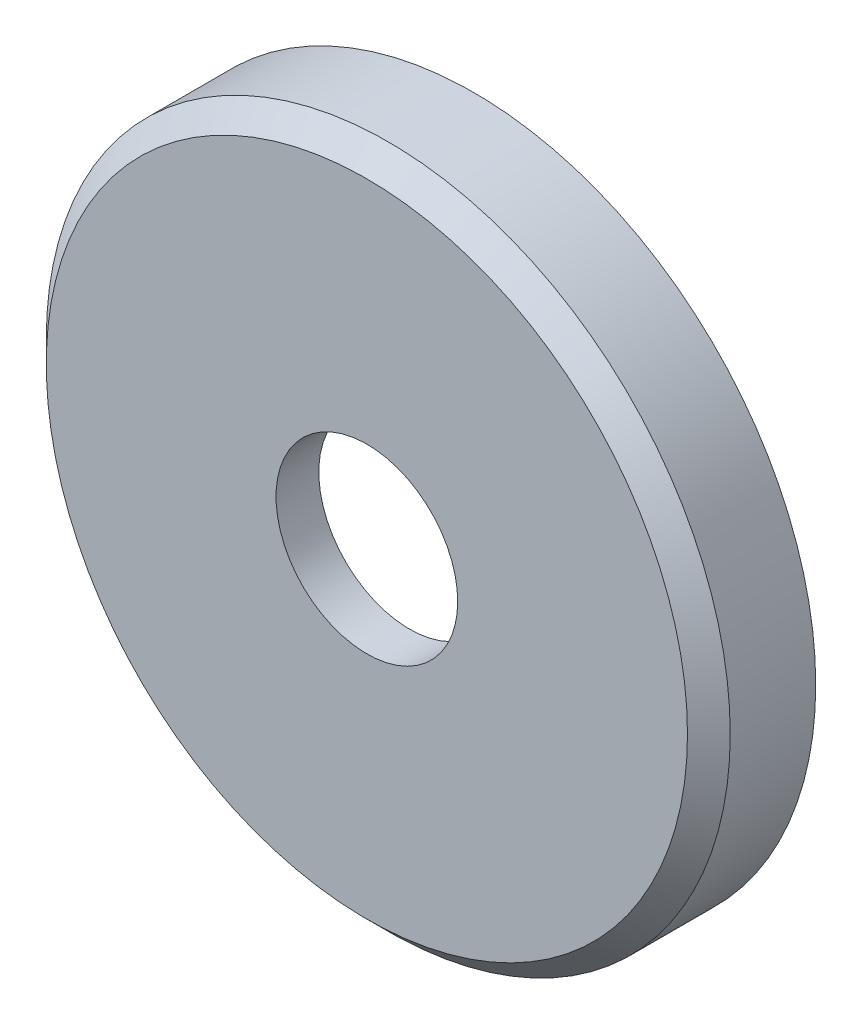
ISO-10303-21;
HEADER;
FILE_DESCRIPTION(('STEP AP214'),'2;1');
FILE_NAME('part.step','',(''),(''),'','','');
FILE_SCHEMA(('AUTOMOTIVE_DESIGN { 1 0 10303 214 1 1 1 1 }'));
ENDSEC;
DATA;
#1=APPLICATION_CONTEXT('core data for automotive mechanical design processes');
#2=APPLICATION_PROTOCOL_DEFINITION('international standard','automotive_design',2000,#1);
#3=PRODUCT_CONTEXT('',#1,'mechanical');
#4=PRODUCT('Part','Part','',(#3));
#5=PRODUCT_RELATED_PRODUCT_CATEGORY('part','',(#4));
#6=PRODUCT_DEFINITION_FORMATION('','',#4);
#7=PRODUCT_DEFINITION_CONTEXT('part definition',#1,'design');
#8=PRODUCT_DEFINITION('design','',#6,#7);
#9=PRODUCT_DEFINITION_SHAPE('','',#8);
#10=(LENGTH_UNIT() NAMED_UNIT(*) SI_UNIT(.MILLI.,.METRE.));
#11=(NAMED_UNIT(*) PLANE_ANGLE_UNIT() SI_UNIT($,.RADIAN.));
#12=(NAMED_UNIT(*) SI_UNIT($,.STERADIAN.) SOLID_ANGLE_UNIT());
#13=UNCERTAINTY_MEASURE_WITH_UNIT(LENGTH_MEASURE(1.E-05),#10,'distance_accuracy_value','');
#14=(GEOMETRIC_REPRESENTATION_CONTEXT(3) GLOBAL_UNCERTAINTY_ASSIGNED_CONTEXT((#13)) GLOBAL_UNIT_ASSIGNED_CONTEXT((#10,
#11,#12)) REPRESENTATION_CONTEXT('',''));
#15=CARTESIAN_POINT('',(0.,0.,0.));
#16=DIRECTION('',(0.,0.,1.));
#17=DIRECTION('',(1.,0.,0.));
#18=AXIS2_PLACEMENT_3D('',#15,#16,#17);
#19=CARTESIAN_POINT('',(0.,0.,0.));
#20=DIRECTION('',(0.,0.,1.));
#21=DIRECTION('',(1.,0.,0.));
#22=AXIS2_PLACEMENT_3D('',#19,#20,#21);
#23=PLANE('',#22);
#24=CARTESIAN_POINT('',(0.,0.,0.));
#25=DIRECTION('',(0.,0.,1.));
#26=DIRECTION('',(1.,0.,0.));
#27=AXIS2_PLACEMENT_3D('',#24,#25,#26);
#28=CIRCLE('',#27,16.);
#29=CARTESIAN_POINT('',(16.,0.,0.));
#30=VERTEX_POINT('',#29);
#31=EDGE_CURVE('E43',#30,#30,#28,.T.);
#32=ORIENTED_EDGE('',*,*,#31,.F.);
#33=EDGE_LOOP('',(#32));
#34=FACE_BOUND('',#33,.T.);
#35=CARTESIAN_POINT('',(0.,0.,0.));
#36=DIRECTION('',(0.,0.,1.));
#37=DIRECTION('',(1.,0.,0.));
#38=AXIS2_PLACEMENT_3D('',#35,#36,#37);
#39=CIRCLE('',#38,12.5);
#40=CARTESIAN_POINT('',(12.5,0.,0.));
#41=VERTEX_POINT('',#40);
#42=EDGE_CURVE('E47',#41,#41,#39,.T.);
#43=ORIENTED_EDGE('',*,*,#42,.T.);
#44=EDGE_LOOP('',(#43));
#45=FACE_BOUND('',#44,.T.);
#46=ADVANCED_FACE('F32',(#34,#45),#23,.F.);
#47=CARTESIAN_POINT('',(0.,0.,3.));
#48=DIRECTION('',(0.,0.,-1.));
#49=DIRECTION('',(-1.,0.,0.));
#50=AXIS2_PLACEMENT_3D('',#47,#48,#49);
#51=CYLINDRICAL_SURFACE('',#50,16.);
#52=CARTESIAN_POINT('',(0.,0.,4.));
#53=DIRECTION('',(0.,0.,1.));
#54=DIRECTION('',(1.,0.,0.));
#55=AXIS2_PLACEMENT_3D('',#52,#53,#54);
#56=CIRCLE('',#55,16.);
#57=CARTESIAN_POINT('',(16.,0.,4.));
#58=VERTEX_POINT('',#57);
#59=EDGE_CURVE('E10',#58,#58,#56,.F.);
#60=ORIENTED_EDGE('',*,*,#59,.T.);
#61=EDGE_LOOP('',(#60));
#62=FACE_BOUND('',#61,.T.);
#63=ORIENTED_EDGE('',*,*,#31,.T.);
#64=EDGE_LOOP('',(#63));
#65=FACE_BOUND('',#64,.T.);
#66=ADVANCED_FACE('F78',(#62,#65),#51,.T.);
#67=CARTESIAN_POINT('',(0.,0.,3.));
#68=DIRECTION('',(0.,0.,-1.));
#69=DIRECTION('',(-1.,0.,0.));
#70=AXIS2_PLACEMENT_3D('',#67,#68,#69);
#71=CYLINDRICAL_SURFACE('',#70,12.5);
#72=CARTESIAN_POINT('',(0.,0.,3.));
#73=DIRECTION('',(0.,0.,1.));
#74=DIRECTION('',(1.,0.,0.));
#75=AXIS2_PLACEMENT_3D('',#72,#73,#74);
#76=CIRCLE('',#75,12.5);
#77=CARTESIAN_POINT('',(12.5,0.,3.));
#78=VERTEX_POINT('',#77);
#79=EDGE_CURVE('E52',#78,#78,#76,.T.);
#80=ORIENTED_EDGE('',*,*,#79,.T.);
#81=EDGE_LOOP('',(#80));
#82=FACE_BOUND('',#81,.T.);
#83=ORIENTED_EDGE('',*,*,#42,.F.);
#84=EDGE_LOOP('',(#83));
#85=FACE_BOUND('',#84,.T.);
#86=ADVANCED_FACE('F74',(#82,#85),#71,.F.);
#87=CARTESIAN_POINT('',(0.,0.,3.));
#88=DIRECTION('',(0.,0.,1.));
#89=DIRECTION('',(1.,0.,0.));
#90=AXIS2_PLACEMENT_3D('',#87,#88,#89);
#91=PLANE('',#90);
#92=CARTESIAN_POINT('',(0.,0.,3.));
#93=DIRECTION('',(0.,0.,1.));
#94=DIRECTION('',(1.,0.,0.));
#95=AXIS2_PLACEMENT_3D('',#92,#93,#94);
#96=CIRCLE('',#95,4.25);
#97=CARTESIAN_POINT('',(4.25,0.,3.));
#98=VERTEX_POINT('',#97);
#99=EDGE_CURVE('E56',#98,#98,#96,.T.);
#100=ORIENTED_EDGE('',*,*,#99,.T.);
#101=EDGE_LOOP('',(#100));
#102=FACE_BOUND('',#101,.T.);
#103=ORIENTED_EDGE('',*,*,#79,.F.);
#104=EDGE_LOOP('',(#103));
#105=FACE_BOUND('',#104,.T.);
#106=ADVANCED_FACE('F67',(#102,#105),#91,.F.);
#107=CARTESIAN_POINT('',(0.,0.,5.));
#108=DIRECTION('',(0.,0.,1.));
#109=DIRECTION('',(1.,0.,0.));
#110=AXIS2_PLACEMENT_3D('',#107,#108,#109);
#111=PLANE('',#110);
#112=CARTESIAN_POINT('',(0.,0.,5.));
#113=DIRECTION('',(0.,0.,1.));
#114=DIRECTION('',(1.,0.,0.));
#115=AXIS2_PLACEMENT_3D('',#112,#113,#114);
#116=CIRCLE('',#115,15.);
#117=CARTESIAN_POINT('',(15.,0.,5.));
#118=VERTEX_POINT('',#117);
#119=EDGE_CURVE('E39',#118,#118,#116,.T.);
#120=ORIENTED_EDGE('',*,*,#119,.T.);
#121=EDGE_LOOP('',(#120));
#122=FACE_BOUND('',#121,.T.);
#123=CARTESIAN_POINT('',(0.,0.,5.));
#124=DIRECTION('',(0.,0.,1.));
#125=DIRECTION('',(1.,0.,0.));
#126=AXIS2_PLACEMENT_3D('',#123,#124,#125);
#127=CIRCLE('',#126,4.25);
#128=CARTESIAN_POINT('',(4.25,0.,5.));
#129=VERTEX_POINT('',#128);
#130=EDGE_CURVE('E55',#129,#129,#127,.T.);
#131=ORIENTED_EDGE('',*,*,#130,.F.);
#132=EDGE_LOOP('',(#131));
#133=FACE_BOUND('',#132,.T.);
#134=ADVANCED_FACE('F65',(#122,#133),#111,.T.);
#135=CARTESIAN_POINT('',(0.,0.,5.));
#136=DIRECTION('',(0.,0.,-1.));
#137=DIRECTION('',(-1.,0.,0.));
#138=AXIS2_PLACEMENT_3D('',#135,#136,#137);
#139=CYLINDRICAL_SURFACE('',#138,4.25);
#140=ORIENTED_EDGE('',*,*,#130,.T.);
#141=EDGE_LOOP('',(#140));
#142=FACE_BOUND('',#141,.T.);
#143=ORIENTED_EDGE('',*,*,#99,.F.);
#144=EDGE_LOOP('',(#143));
#145=FACE_BOUND('',#144,.T.);
#146=ADVANCED_FACE('F62',(#142,#145),#139,.F.);
#147=CARTESIAN_POINT('',(0.,0.,5.));
#148=DIRECTION('',(0.,0.,-1.));
#149=DIRECTION('',(-1.,0.,0.));
#150=AXIS2_PLACEMENT_3D('',#147,#148,#149);
#151=CONICAL_SURFACE('',#150,15.,0.785398163397448);
#152=ORIENTED_EDGE('',*,*,#59,.F.);
#153=EDGE_LOOP('',(#152));
#154=FACE_BOUND('',#153,.T.);
#155=ORIENTED_EDGE('',*,*,#119,.F.);
#156=EDGE_LOOP('',(#155));
#157=FACE_BOUND('',#156,.T.);
#158=ADVANCED_FACE('F34',(#154,#157),#151,.T.);
#159=CLOSED_SHELL('',(#46,#66,#86,#106,#134,#146,#158));
#160=MANIFOLD_SOLID_BREP('B2',#159);
#161=ADVANCED_BREP_SHAPE_REPRESENTATION('',(#18,#160),#14);
#162=SHAPE_DEFINITION_REPRESENTATION(#9,#161);
ENDSEC;
END-ISO-10303-21;
